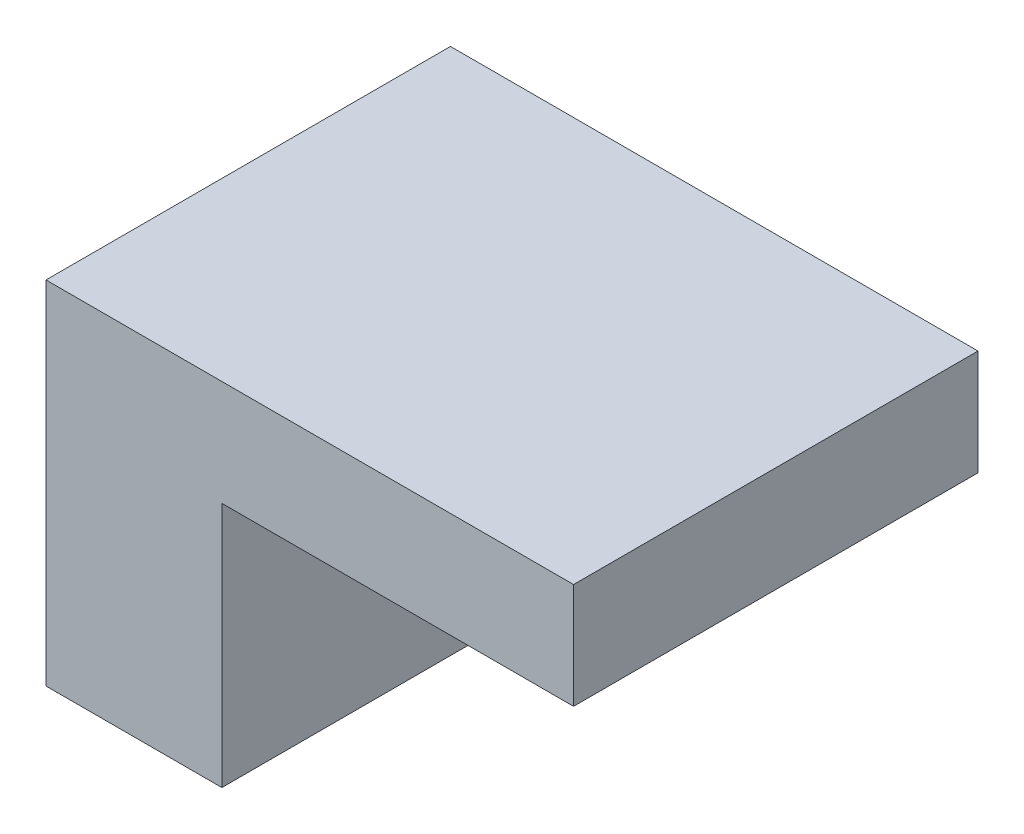
ISO-10303-21;
HEADER;
FILE_DESCRIPTION(('STEP AP214'),'2;1');
FILE_NAME('part.step','',(''),(''),'','','');
FILE_SCHEMA(('AUTOMOTIVE_DESIGN { 1 0 10303 214 1 1 1 1 }'));
ENDSEC;
DATA;
#1=APPLICATION_CONTEXT('core data for automotive mechanical design processes');
#2=APPLICATION_PROTOCOL_DEFINITION('international standard','automotive_design',2000,#1);
#3=PRODUCT_CONTEXT('',#1,'mechanical');
#4=PRODUCT('Part','Part','',(#3));
#5=PRODUCT_RELATED_PRODUCT_CATEGORY('part','',(#4));
#6=PRODUCT_DEFINITION_FORMATION('','',#4);
#7=PRODUCT_DEFINITION_CONTEXT('part definition',#1,'design');
#8=PRODUCT_DEFINITION('design','',#6,#7);
#9=PRODUCT_DEFINITION_SHAPE('','',#8);
#10=(LENGTH_UNIT() NAMED_UNIT(*) SI_UNIT(.MILLI.,.METRE.));
#11=(NAMED_UNIT(*) PLANE_ANGLE_UNIT() SI_UNIT($,.RADIAN.));
#12=(NAMED_UNIT(*) SI_UNIT($,.STERADIAN.) SOLID_ANGLE_UNIT());
#13=UNCERTAINTY_MEASURE_WITH_UNIT(LENGTH_MEASURE(1.E-05),#10,'distance_accuracy_value','');
#14=(GEOMETRIC_REPRESENTATION_CONTEXT(3) GLOBAL_UNCERTAINTY_ASSIGNED_CONTEXT((#13)) GLOBAL_UNIT_ASSIGNED_CONTEXT((#10,
#11,#12)) REPRESENTATION_CONTEXT('',''));
#15=CARTESIAN_POINT('',(0.,0.,0.));
#16=DIRECTION('',(0.,0.,1.));
#17=DIRECTION('',(1.,0.,0.));
#18=AXIS2_PLACEMENT_3D('',#15,#16,#17);
#19=CARTESIAN_POINT('',(50.,0.,115.));
#20=DIRECTION('',(0.,1.,0.));
#21=DIRECTION('',(0.,0.,1.));
#22=AXIS2_PLACEMENT_3D('',#19,#20,#21);
#23=PLANE('',#22);
#24=DIRECTION('',(0.,0.,-1.));
#25=VECTOR('',#24,1.);
#26=CARTESIAN_POINT('',(0.,0.,115.));
#27=LINE('',#26,#25);
#28=CARTESIAN_POINT('',(0.,0.,115.));
#29=VERTEX_POINT('',#28);
#30=CARTESIAN_POINT('',(0.,0.,0.));
#31=VERTEX_POINT('',#30);
#32=EDGE_CURVE('E168',#29,#31,#27,.T.);
#33=ORIENTED_EDGE('',*,*,#32,.T.);
#34=DIRECTION('',(1.,0.,0.));
#35=VECTOR('',#34,1.);
#36=CARTESIAN_POINT('',(50.,0.,0.));
#37=LINE('',#36,#35);
#38=CARTESIAN_POINT('',(50.,0.,0.));
#39=VERTEX_POINT('',#38);
#40=EDGE_CURVE('E147',#31,#39,#37,.T.);
#41=ORIENTED_EDGE('',*,*,#40,.T.);
#42=DIRECTION('',(0.,0.,-1.));
#43=VECTOR('',#42,1.);
#44=CARTESIAN_POINT('',(50.,0.,115.));
#45=LINE('',#44,#43);
#46=CARTESIAN_POINT('',(50.,0.,115.));
#47=VERTEX_POINT('',#46);
#48=EDGE_CURVE('E11',#47,#39,#45,.T.);
#49=ORIENTED_EDGE('',*,*,#48,.F.);
#50=DIRECTION('',(1.,0.,0.));
#51=VECTOR('',#50,1.);
#52=CARTESIAN_POINT('',(50.,0.,115.));
#53=LINE('',#52,#51);
#54=EDGE_CURVE('E148',#29,#47,#53,.T.);
#55=ORIENTED_EDGE('',*,*,#54,.F.);
#56=EDGE_LOOP('',(#33,#41,#49,#55));
#57=FACE_BOUND('',#56,.T.);
#58=ADVANCED_FACE('F43',(#57),#23,.F.);
#59=CARTESIAN_POINT('',(50.,70.,115.));
#60=DIRECTION('',(-1.,0.,0.));
#61=DIRECTION('',(0.,0.,1.));
#62=AXIS2_PLACEMENT_3D('',#59,#60,#61);
#63=PLANE('',#62);
#64=DIRECTION('',(0.,0.,1.));
#65=VECTOR('',#64,1.);
#66=CARTESIAN_POINT('',(50.,24.1459597152363,115.));
#67=LINE('',#66,#65);
#68=CARTESIAN_POINT('',(50.,24.1459597152363,52.5));
#69=VERTEX_POINT('',#68);
#70=CARTESIAN_POINT('',(50.,24.1459597152363,62.5));
#71=VERTEX_POINT('',#70);
#72=EDGE_CURVE('E58',#69,#71,#67,.T.);
#73=ORIENTED_EDGE('',*,*,#72,.T.);
#74=DIRECTION('',(0.,1.,0.));
#75=VECTOR('',#74,1.);
#76=CARTESIAN_POINT('',(50.,70.,62.5));
#77=LINE('',#76,#75);
#78=CARTESIAN_POINT('',(50.,70.,62.5));
#79=VERTEX_POINT('',#78);
#80=EDGE_CURVE('E124',#71,#79,#77,.T.);
#81=ORIENTED_EDGE('',*,*,#80,.T.);
#82=DIRECTION('',(0.,0.,-1.));
#83=VECTOR('',#82,1.);
#84=CARTESIAN_POINT('',(50.,70.,115.));
#85=LINE('',#84,#83);
#86=CARTESIAN_POINT('',(50.,70.,115.));
#87=VERTEX_POINT('',#86);
#88=EDGE_CURVE('E51',#87,#79,#85,.T.);
#89=ORIENTED_EDGE('',*,*,#88,.F.);
#90=DIRECTION('',(0.,1.,0.));
#91=VECTOR('',#90,1.);
#92=CARTESIAN_POINT('',(50.,70.,115.));
#93=LINE('',#92,#91);
#94=EDGE_CURVE('E152',#47,#87,#93,.T.);
#95=ORIENTED_EDGE('',*,*,#94,.F.);
#96=ORIENTED_EDGE('',*,*,#48,.T.);
#97=DIRECTION('',(0.,1.,0.));
#98=VECTOR('',#97,1.);
#99=CARTESIAN_POINT('',(50.,70.,0.));
#100=LINE('',#99,#98);
#101=CARTESIAN_POINT('',(50.,70.,0.));
#102=VERTEX_POINT('',#101);
#103=EDGE_CURVE('E172',#39,#102,#100,.T.);
#104=ORIENTED_EDGE('',*,*,#103,.T.);
#105=CARTESIAN_POINT('',(50.,70.,52.5));
#106=VERTEX_POINT('',#105);
#107=EDGE_CURVE('E201',#106,#102,#85,.T.);
#108=ORIENTED_EDGE('',*,*,#107,.F.);
#109=DIRECTION('',(0.,1.,0.));
#110=VECTOR('',#109,1.);
#111=CARTESIAN_POINT('',(50.,70.,52.5));
#112=LINE('',#111,#110);
#113=EDGE_CURVE('E63',#69,#106,#112,.T.);
#114=ORIENTED_EDGE('',*,*,#113,.F.);
#115=EDGE_LOOP('',(#73,#81,#89,#95,#96,#104,#108,#114));
#116=FACE_BOUND('',#115,.T.);
#117=ADVANCED_FACE('F208',(#116),#63,.F.);
#118=CARTESIAN_POINT('',(150.,70.,115.));
#119=DIRECTION('',(0.,1.,0.));
#120=DIRECTION('',(-1.,0.,0.));
#121=AXIS2_PLACEMENT_3D('',#118,#119,#120);
#122=PLANE('',#121);
#123=ORIENTED_EDGE('',*,*,#88,.T.);
#124=DIRECTION('',(1.,0.,0.));
#125=VECTOR('',#124,1.);
#126=CARTESIAN_POINT('',(150.,70.,62.5));
#127=LINE('',#126,#125);
#128=CARTESIAN_POINT('',(112.936918037911,70.,62.5));
#129=VERTEX_POINT('',#128);
#130=EDGE_CURVE('E118',#79,#129,#127,.T.);
#131=ORIENTED_EDGE('',*,*,#130,.T.);
#132=DIRECTION('',(0.,0.,-1.));
#133=VECTOR('',#132,1.);
#134=CARTESIAN_POINT('',(112.936918037911,70.,115.));
#135=LINE('',#134,#133);
#136=CARTESIAN_POINT('',(112.936918037911,70.,52.5));
#137=VERTEX_POINT('',#136);
#138=EDGE_CURVE('E112',#129,#137,#135,.T.);
#139=ORIENTED_EDGE('',*,*,#138,.T.);
#140=DIRECTION('',(1.,0.,0.));
#141=VECTOR('',#140,1.);
#142=CARTESIAN_POINT('',(150.,70.,52.5));
#143=LINE('',#142,#141);
#144=EDGE_CURVE('E116',#106,#137,#143,.T.);
#145=ORIENTED_EDGE('',*,*,#144,.F.);
#146=ORIENTED_EDGE('',*,*,#107,.T.);
#147=DIRECTION('',(1.,0.,0.));
#148=VECTOR('',#147,1.);
#149=CARTESIAN_POINT('',(150.,70.,0.));
#150=LINE('',#149,#148);
#151=CARTESIAN_POINT('',(150.,70.,0.));
#152=VERTEX_POINT('',#151);
#153=EDGE_CURVE('E176',#102,#152,#150,.T.);
#154=ORIENTED_EDGE('',*,*,#153,.T.);
#155=DIRECTION('',(0.,0.,-1.));
#156=VECTOR('',#155,1.);
#157=CARTESIAN_POINT('',(150.,70.,115.));
#158=LINE('',#157,#156);
#159=CARTESIAN_POINT('',(150.,70.,115.));
#160=VERTEX_POINT('',#159);
#161=EDGE_CURVE('E198',#160,#152,#158,.T.);
#162=ORIENTED_EDGE('',*,*,#161,.F.);
#163=DIRECTION('',(1.,0.,0.));
#164=VECTOR('',#163,1.);
#165=CARTESIAN_POINT('',(150.,70.,115.));
#166=LINE('',#165,#164);
#167=EDGE_CURVE('E156',#87,#160,#166,.T.);
#168=ORIENTED_EDGE('',*,*,#167,.F.);
#169=EDGE_LOOP('',(#123,#131,#139,#145,#146,#154,#162,#168));
#170=FACE_BOUND('',#169,.T.);
#171=ADVANCED_FACE('F115',(#170),#122,.F.);
#172=CARTESIAN_POINT('',(150.,100.,115.));
#173=DIRECTION('',(-1.,0.,0.));
#174=DIRECTION('',(0.,0.,1.));
#175=AXIS2_PLACEMENT_3D('',#172,#173,#174);
#176=PLANE('',#175);
#177=DIRECTION('',(0.,1.,0.));
#178=VECTOR('',#177,1.);
#179=CARTESIAN_POINT('',(150.,100.,0.));
#180=LINE('',#179,#178);
#181=CARTESIAN_POINT('',(150.,100.,0.));
#182=VERTEX_POINT('',#181);
#183=EDGE_CURVE('E179',#152,#182,#180,.T.);
#184=ORIENTED_EDGE('',*,*,#183,.T.);
#185=DIRECTION('',(0.,0.,-1.));
#186=VECTOR('',#185,1.);
#187=CARTESIAN_POINT('',(150.,100.,115.));
#188=LINE('',#187,#186);
#189=CARTESIAN_POINT('',(150.,100.,115.));
#190=VERTEX_POINT('',#189);
#191=EDGE_CURVE('E195',#190,#182,#188,.T.);
#192=ORIENTED_EDGE('',*,*,#191,.F.);
#193=DIRECTION('',(0.,1.,0.));
#194=VECTOR('',#193,1.);
#195=CARTESIAN_POINT('',(150.,100.,115.));
#196=LINE('',#195,#194);
#197=EDGE_CURVE('E159',#160,#190,#196,.T.);
#198=ORIENTED_EDGE('',*,*,#197,.F.);
#199=ORIENTED_EDGE('',*,*,#161,.T.);
#200=EDGE_LOOP('',(#184,#192,#198,#199));
#201=FACE_BOUND('',#200,.T.);
#202=ADVANCED_FACE('F218',(#201),#176,.F.);
#203=CARTESIAN_POINT('',(0.,100.,115.));
#204=DIRECTION('',(0.,-1.,0.));
#205=DIRECTION('',(0.,0.,-1.));
#206=AXIS2_PLACEMENT_3D('',#203,#204,#205);
#207=PLANE('',#206);
#208=ORIENTED_EDGE('',*,*,#191,.T.);
#209=DIRECTION('',(-1.,0.,0.));
#210=VECTOR('',#209,1.);
#211=CARTESIAN_POINT('',(0.,100.,0.));
#212=LINE('',#211,#210);
#213=CARTESIAN_POINT('',(0.,100.,0.));
#214=VERTEX_POINT('',#213);
#215=EDGE_CURVE('E183',#182,#214,#212,.T.);
#216=ORIENTED_EDGE('',*,*,#215,.T.);
#217=DIRECTION('',(0.,0.,-1.));
#218=VECTOR('',#217,1.);
#219=CARTESIAN_POINT('',(0.,100.,115.));
#220=LINE('',#219,#218);
#221=CARTESIAN_POINT('',(0.,100.,115.));
#222=VERTEX_POINT('',#221);
#223=EDGE_CURVE('E192',#222,#214,#220,.T.);
#224=ORIENTED_EDGE('',*,*,#223,.F.);
#225=DIRECTION('',(-1.,0.,0.));
#226=VECTOR('',#225,1.);
#227=CARTESIAN_POINT('',(0.,100.,115.));
#228=LINE('',#227,#226);
#229=EDGE_CURVE('E162',#190,#222,#228,.T.);
#230=ORIENTED_EDGE('',*,*,#229,.F.);
#231=EDGE_LOOP('',(#208,#216,#224,#230));
#232=FACE_BOUND('',#231,.T.);
#233=ADVANCED_FACE('F245',(#232),#207,.F.);
#234=CARTESIAN_POINT('',(0.,0.,115.));
#235=DIRECTION('',(1.,0.,0.));
#236=DIRECTION('',(0.,0.,-1.));
#237=AXIS2_PLACEMENT_3D('',#234,#235,#236);
#238=PLANE('',#237);
#239=ORIENTED_EDGE('',*,*,#223,.T.);
#240=DIRECTION('',(0.,-1.,0.));
#241=VECTOR('',#240,1.);
#242=CARTESIAN_POINT('',(0.,0.,0.));
#243=LINE('',#242,#241);
#244=EDGE_CURVE('E153',#214,#31,#243,.T.);
#245=ORIENTED_EDGE('',*,*,#244,.T.);
#246=ORIENTED_EDGE('',*,*,#32,.F.);
#247=DIRECTION('',(0.,-1.,0.));
#248=VECTOR('',#247,1.);
#249=CARTESIAN_POINT('',(0.,0.,115.));
#250=LINE('',#249,#248);
#251=EDGE_CURVE('E165',#222,#29,#250,.T.);
#252=ORIENTED_EDGE('',*,*,#251,.F.);
#253=EDGE_LOOP('',(#239,#245,#246,#252));
#254=FACE_BOUND('',#253,.T.);
#255=ADVANCED_FACE('F242',(#254),#238,.F.);
#256=CARTESIAN_POINT('',(0.,0.,115.));
#257=DIRECTION('',(0.,0.,-1.));
#258=DIRECTION('',(-1.,0.,0.));
#259=AXIS2_PLACEMENT_3D('',#256,#257,#258);
#260=PLANE('',#259);
#261=ORIENTED_EDGE('',*,*,#54,.T.);
#262=ORIENTED_EDGE('',*,*,#94,.T.);
#263=ORIENTED_EDGE('',*,*,#167,.T.);
#264=ORIENTED_EDGE('',*,*,#197,.T.);
#265=ORIENTED_EDGE('',*,*,#229,.T.);
#266=ORIENTED_EDGE('',*,*,#251,.T.);
#267=EDGE_LOOP('',(#261,#262,#263,#264,#265,#266));
#268=FACE_BOUND('',#267,.T.);
#269=ADVANCED_FACE('F222',(#268),#260,.F.);
#270=CARTESIAN_POINT('',(0.,0.,0.));
#271=DIRECTION('',(0.,0.,-1.));
#272=DIRECTION('',(-1.,0.,0.));
#273=AXIS2_PLACEMENT_3D('',#270,#271,#272);
#274=PLANE('',#273);
#275=ORIENTED_EDGE('',*,*,#40,.F.);
#276=ORIENTED_EDGE('',*,*,#244,.F.);
#277=ORIENTED_EDGE('',*,*,#215,.F.);
#278=ORIENTED_EDGE('',*,*,#183,.F.);
#279=ORIENTED_EDGE('',*,*,#153,.F.);
#280=ORIENTED_EDGE('',*,*,#103,.F.);
#281=EDGE_LOOP('',(#275,#276,#277,#278,#279,#280));
#282=FACE_BOUND('',#281,.T.);
#283=ADVANCED_FACE('F213',(#282),#274,.T.);
#284=CARTESIAN_POINT('',(25.6084315391977,6.37495983665176,57.5));
#285=DIRECTION('',(0.588858018680659,-0.808236496228356,0.));
#286=DIRECTION('',(0.808236496228356,0.588858018680659,0.));
#287=AXIS2_PLACEMENT_3D('',#284,#285,#286);
#288=PLANE('',#287);
#289=ORIENTED_EDGE('',*,*,#72,.F.);
#290=DIRECTION('',(0.808236496228356,0.588858018680659,0.));
#291=VECTOR('',#290,1.);
#292=CARTESIAN_POINT('',(25.6084315391977,6.37495983665176,52.5));
#293=LINE('',#292,#291);
#294=EDGE_CURVE('E129',#69,#137,#293,.T.);
#295=ORIENTED_EDGE('',*,*,#294,.T.);
#296=ORIENTED_EDGE('',*,*,#138,.F.);
#297=DIRECTION('',(0.808236496228356,0.588858018680659,0.));
#298=VECTOR('',#297,1.);
#299=CARTESIAN_POINT('',(25.6084315391977,6.37495983665176,62.5));
#300=LINE('',#299,#298);
#301=EDGE_CURVE('E131',#71,#129,#300,.T.);
#302=ORIENTED_EDGE('',*,*,#301,.F.);
#303=EDGE_LOOP('',(#289,#295,#296,#302));
#304=FACE_BOUND('',#303,.T.);
#305=ADVANCED_FACE('F133',(#304),#288,.T.);
#306=CARTESIAN_POINT('',(75.,50.,62.5));
#307=DIRECTION('',(0.,0.,1.));
#308=DIRECTION('',(1.,0.,0.));
#309=AXIS2_PLACEMENT_3D('',#306,#307,#308);
#310=PLANE('',#309);
#311=ORIENTED_EDGE('',*,*,#80,.F.);
#312=ORIENTED_EDGE('',*,*,#301,.T.);
#313=ORIENTED_EDGE('',*,*,#130,.F.);
#314=EDGE_LOOP('',(#311,#312,#313));
#315=FACE_BOUND('',#314,.T.);
#316=ADVANCED_FACE('F225',(#315),#310,.T.);
#317=CARTESIAN_POINT('',(75.,50.,52.5));
#318=DIRECTION('',(0.,0.,1.));
#319=DIRECTION('',(1.,0.,0.));
#320=AXIS2_PLACEMENT_3D('',#317,#318,#319);
#321=PLANE('',#320);
#322=ORIENTED_EDGE('',*,*,#294,.F.);
#323=ORIENTED_EDGE('',*,*,#113,.T.);
#324=ORIENTED_EDGE('',*,*,#144,.T.);
#325=EDGE_LOOP('',(#322,#323,#324));
#326=FACE_BOUND('',#325,.T.);
#327=ADVANCED_FACE('F128',(#326),#321,.F.);
#328=CLOSED_SHELL('',(#58,#117,#171,#202,#233,#255,#269,#283,#305,#316,#327));
#329=MANIFOLD_SOLID_BREP('B2',#328);
#330=ADVANCED_BREP_SHAPE_REPRESENTATION('',(#18,#329),#14);
#331=SHAPE_DEFINITION_REPRESENTATION(#9,#330);
ENDSEC;
END-ISO-10303-21;
